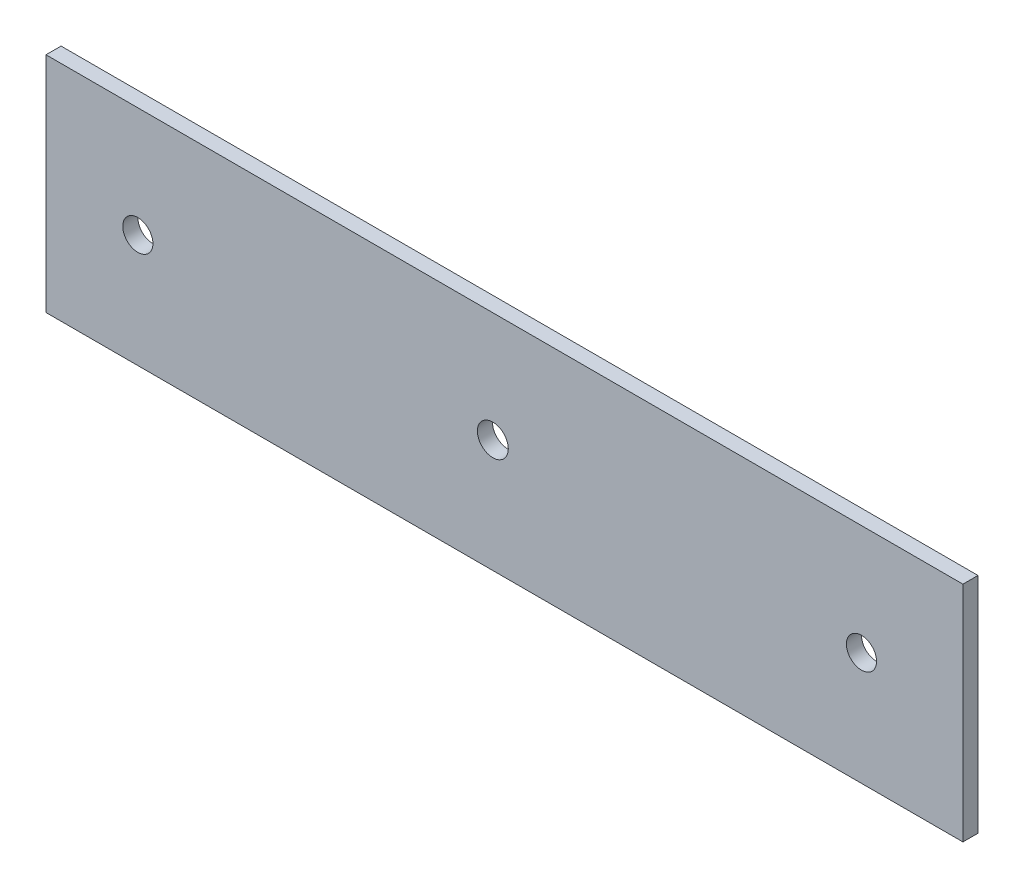
ISO-10303-21;
HEADER;
FILE_DESCRIPTION(('STEP AP214'),'2;1');
FILE_NAME('part.step','',(''),(''),'','','');
FILE_SCHEMA(('AUTOMOTIVE_DESIGN { 1 0 10303 214 1 1 1 1 }'));
ENDSEC;
DATA;
#1=APPLICATION_CONTEXT('core data for automotive mechanical design processes');
#2=APPLICATION_PROTOCOL_DEFINITION('international standard','automotive_design',2000,#1);
#3=PRODUCT_CONTEXT('',#1,'mechanical');
#4=PRODUCT('Part','Part','',(#3));
#5=PRODUCT_RELATED_PRODUCT_CATEGORY('part','',(#4));
#6=PRODUCT_DEFINITION_FORMATION('','',#4);
#7=PRODUCT_DEFINITION_CONTEXT('part definition',#1,'design');
#8=PRODUCT_DEFINITION('design','',#6,#7);
#9=PRODUCT_DEFINITION_SHAPE('','',#8);
#10=(LENGTH_UNIT() NAMED_UNIT(*) SI_UNIT(.MILLI.,.METRE.));
#11=(NAMED_UNIT(*) PLANE_ANGLE_UNIT() SI_UNIT($,.RADIAN.));
#12=(NAMED_UNIT(*) SI_UNIT($,.STERADIAN.) SOLID_ANGLE_UNIT());
#13=UNCERTAINTY_MEASURE_WITH_UNIT(LENGTH_MEASURE(1.E-05),#10,'distance_accuracy_value','');
#14=(GEOMETRIC_REPRESENTATION_CONTEXT(3) GLOBAL_UNCERTAINTY_ASSIGNED_CONTEXT((#13)) GLOBAL_UNIT_ASSIGNED_CONTEXT((#10,
#11,#12)) REPRESENTATION_CONTEXT('',''));
#15=CARTESIAN_POINT('',(0.,0.,0.));
#16=DIRECTION('',(0.,0.,1.));
#17=DIRECTION('',(1.,0.,0.));
#18=AXIS2_PLACEMENT_3D('',#15,#16,#17);
#19=CARTESIAN_POINT('',(0.,0.,3.175));
#20=DIRECTION('',(0.,0.,1.));
#21=DIRECTION('',(1.,0.,0.));
#22=AXIS2_PLACEMENT_3D('',#19,#20,#21);
#23=PLANE('',#22);
#24=CARTESIAN_POINT('',(228.6,-2.22044604925031E-13,3.175));
#25=DIRECTION('',(0.,0.,1.));
#26=DIRECTION('',(1.,0.,0.));
#27=AXIS2_PLACEMENT_3D('',#24,#25,#26);
#28=CIRCLE('',#27,3.175);
#29=CARTESIAN_POINT('',(231.775,-2.22044604925031E-13,3.175));
#30=VERTEX_POINT('',#29);
#31=EDGE_CURVE('E121',#30,#30,#28,.T.);
#32=ORIENTED_EDGE('',*,*,#31,.F.);
#33=EDGE_LOOP('',(#32));
#34=FACE_BOUND('',#33,.T.);
#35=DIRECTION('',(0.,-1.,0.));
#36=VECTOR('',#35,1.);
#37=CARTESIAN_POINT('',(56.8583118313128,23.1921422315717,3.175));
#38=LINE('',#37,#36);
#39=CARTESIAN_POINT('',(56.8583118313128,23.1921422315717,3.175));
#40=VERTEX_POINT('',#39);
#41=CARTESIAN_POINT('',(56.8583118313128,-23.8262851471424,3.175));
#42=VERTEX_POINT('',#41);
#43=EDGE_CURVE('E91',#40,#42,#38,.T.);
#44=ORIENTED_EDGE('',*,*,#43,.T.);
#45=DIRECTION('',(1.,0.,0.));
#46=VECTOR('',#45,1.);
#47=CARTESIAN_POINT('',(56.8583118313128,-23.8262851471424,3.175));
#48=LINE('',#47,#46);
#49=CARTESIAN_POINT('',(249.961982233685,-23.8262851471424,3.175));
#50=VERTEX_POINT('',#49);
#51=EDGE_CURVE('E86',#42,#50,#48,.T.);
#52=ORIENTED_EDGE('',*,*,#51,.T.);
#53=DIRECTION('',(0.,1.,0.));
#54=VECTOR('',#53,1.);
#55=CARTESIAN_POINT('',(249.961982233685,23.1921422315717,3.175));
#56=LINE('',#55,#54);
#57=CARTESIAN_POINT('',(249.961982233685,23.1921422315717,3.175));
#58=VERTEX_POINT('',#57);
#59=EDGE_CURVE('E89',#50,#58,#56,.T.);
#60=ORIENTED_EDGE('',*,*,#59,.T.);
#61=DIRECTION('',(-1.,0.,0.));
#62=VECTOR('',#61,1.);
#63=CARTESIAN_POINT('',(56.8583118313128,23.1921422315717,3.175));
#64=LINE('',#63,#62);
#65=EDGE_CURVE('E56',#58,#40,#64,.T.);
#66=ORIENTED_EDGE('',*,*,#65,.T.);
#67=EDGE_LOOP('',(#44,#52,#60,#66));
#68=FACE_BOUND('',#67,.T.);
#69=CARTESIAN_POINT('',(76.2,5.55111512312578E-13,3.175));
#70=DIRECTION('',(0.,0.,1.));
#71=DIRECTION('',(1.,0.,0.));
#72=AXIS2_PLACEMENT_3D('',#69,#70,#71);
#73=CIRCLE('',#72,3.175);
#74=CARTESIAN_POINT('',(79.375,5.55111512312578E-13,3.175));
#75=VERTEX_POINT('',#74);
#76=EDGE_CURVE('E106',#75,#75,#73,.T.);
#77=ORIENTED_EDGE('',*,*,#76,.F.);
#78=EDGE_LOOP('',(#77));
#79=FACE_BOUND('',#78,.T.);
#80=CARTESIAN_POINT('',(150.964022252178,0.,3.175));
#81=DIRECTION('',(0.,0.,1.));
#82=DIRECTION('',(1.,0.,0.));
#83=AXIS2_PLACEMENT_3D('',#80,#81,#82);
#84=CIRCLE('',#83,3.25120000000001);
#85=CARTESIAN_POINT('',(154.215222252178,0.,3.175));
#86=VERTEX_POINT('',#85);
#87=EDGE_CURVE('E127',#86,#86,#84,.T.);
#88=ORIENTED_EDGE('',*,*,#87,.F.);
#89=EDGE_LOOP('',(#88));
#90=FACE_BOUND('',#89,.T.);
#91=ADVANCED_FACE('F39',(#34,#68,#79,#90),#23,.T.);
#92=CARTESIAN_POINT('',(0.,0.,0.));
#93=DIRECTION('',(0.,0.,1.));
#94=DIRECTION('',(1.,0.,0.));
#95=AXIS2_PLACEMENT_3D('',#92,#93,#94);
#96=PLANE('',#95);
#97=DIRECTION('',(0.,-1.,0.));
#98=VECTOR('',#97,1.);
#99=CARTESIAN_POINT('',(56.8583118313128,23.1921422315717,0.));
#100=LINE('',#99,#98);
#101=CARTESIAN_POINT('',(56.8583118313128,23.1921422315717,0.));
#102=VERTEX_POINT('',#101);
#103=CARTESIAN_POINT('',(56.8583118313128,-23.8262851471424,0.));
#104=VERTEX_POINT('',#103);
#105=EDGE_CURVE('E103',#102,#104,#100,.T.);
#106=ORIENTED_EDGE('',*,*,#105,.F.);
#107=DIRECTION('',(-1.,0.,0.));
#108=VECTOR('',#107,1.);
#109=CARTESIAN_POINT('',(56.8583118313128,23.1921422315717,0.));
#110=LINE('',#109,#108);
#111=CARTESIAN_POINT('',(249.961982233685,23.1921422315717,0.));
#112=VERTEX_POINT('',#111);
#113=EDGE_CURVE('E79',#112,#102,#110,.T.);
#114=ORIENTED_EDGE('',*,*,#113,.F.);
#115=DIRECTION('',(0.,1.,0.));
#116=VECTOR('',#115,1.);
#117=CARTESIAN_POINT('',(249.961982233685,23.1921422315717,0.));
#118=LINE('',#117,#116);
#119=CARTESIAN_POINT('',(249.961982233685,-23.8262851471424,0.));
#120=VERTEX_POINT('',#119);
#121=EDGE_CURVE('E73',#120,#112,#118,.T.);
#122=ORIENTED_EDGE('',*,*,#121,.F.);
#123=DIRECTION('',(1.,0.,0.));
#124=VECTOR('',#123,1.);
#125=CARTESIAN_POINT('',(56.8583118313128,-23.8262851471424,0.));
#126=LINE('',#125,#124);
#127=EDGE_CURVE('E95',#104,#120,#126,.T.);
#128=ORIENTED_EDGE('',*,*,#127,.F.);
#129=EDGE_LOOP('',(#106,#114,#122,#128));
#130=FACE_BOUND('',#129,.T.);
#131=CARTESIAN_POINT('',(76.2,5.55111512312578E-13,0.));
#132=DIRECTION('',(0.,0.,1.));
#133=DIRECTION('',(1.,0.,0.));
#134=AXIS2_PLACEMENT_3D('',#131,#132,#133);
#135=CIRCLE('',#134,3.175);
#136=CARTESIAN_POINT('',(79.375,5.55111512312578E-13,0.));
#137=VERTEX_POINT('',#136);
#138=EDGE_CURVE('E118',#137,#137,#135,.T.);
#139=ORIENTED_EDGE('',*,*,#138,.T.);
#140=EDGE_LOOP('',(#139));
#141=FACE_BOUND('',#140,.T.);
#142=CARTESIAN_POINT('',(228.6,-2.22044604925031E-13,0.));
#143=DIRECTION('',(0.,0.,1.));
#144=DIRECTION('',(1.,0.,0.));
#145=AXIS2_PLACEMENT_3D('',#142,#143,#144);
#146=CIRCLE('',#145,3.175);
#147=CARTESIAN_POINT('',(231.775,-2.22044604925031E-13,0.));
#148=VERTEX_POINT('',#147);
#149=EDGE_CURVE('E124',#148,#148,#146,.T.);
#150=ORIENTED_EDGE('',*,*,#149,.T.);
#151=EDGE_LOOP('',(#150));
#152=FACE_BOUND('',#151,.T.);
#153=CARTESIAN_POINT('',(150.964022252178,0.,0.));
#154=DIRECTION('',(0.,0.,1.));
#155=DIRECTION('',(1.,0.,0.));
#156=AXIS2_PLACEMENT_3D('',#153,#154,#155);
#157=CIRCLE('',#156,3.25120000000001);
#158=CARTESIAN_POINT('',(154.215222252178,0.,0.));
#159=VERTEX_POINT('',#158);
#160=EDGE_CURVE('E130',#159,#159,#157,.T.);
#161=ORIENTED_EDGE('',*,*,#160,.T.);
#162=EDGE_LOOP('',(#161));
#163=FACE_BOUND('',#162,.T.);
#164=ADVANCED_FACE('F114',(#130,#141,#152,#163),#96,.F.);
#165=CARTESIAN_POINT('',(56.8583118313128,23.1921422315717,3.175));
#166=DIRECTION('',(1.,0.,0.));
#167=DIRECTION('',(0.,0.,-1.));
#168=AXIS2_PLACEMENT_3D('',#165,#166,#167);
#169=PLANE('',#168);
#170=ORIENTED_EDGE('',*,*,#105,.T.);
#171=DIRECTION('',(0.,0.,-1.));
#172=VECTOR('',#171,1.);
#173=CARTESIAN_POINT('',(56.8583118313128,-23.8262851471424,3.175));
#174=LINE('',#173,#172);
#175=EDGE_CURVE('E11',#42,#104,#174,.T.);
#176=ORIENTED_EDGE('',*,*,#175,.F.);
#177=ORIENTED_EDGE('',*,*,#43,.F.);
#178=DIRECTION('',(0.,0.,-1.));
#179=VECTOR('',#178,1.);
#180=CARTESIAN_POINT('',(56.8583118313128,23.1921422315717,3.175));
#181=LINE('',#180,#179);
#182=EDGE_CURVE('E99',#40,#102,#181,.T.);
#183=ORIENTED_EDGE('',*,*,#182,.T.);
#184=EDGE_LOOP('',(#170,#176,#177,#183));
#185=FACE_BOUND('',#184,.T.);
#186=ADVANCED_FACE('F41',(#185),#169,.F.);
#187=CARTESIAN_POINT('',(56.8583118313128,-23.8262851471424,3.175));
#188=DIRECTION('',(0.,1.,0.));
#189=DIRECTION('',(0.,0.,1.));
#190=AXIS2_PLACEMENT_3D('',#187,#188,#189);
#191=PLANE('',#190);
#192=ORIENTED_EDGE('',*,*,#127,.T.);
#193=DIRECTION('',(0.,0.,-1.));
#194=VECTOR('',#193,1.);
#195=CARTESIAN_POINT('',(249.961982233685,-23.8262851471424,3.175));
#196=LINE('',#195,#194);
#197=EDGE_CURVE('E48',#50,#120,#196,.T.);
#198=ORIENTED_EDGE('',*,*,#197,.F.);
#199=ORIENTED_EDGE('',*,*,#51,.F.);
#200=ORIENTED_EDGE('',*,*,#175,.T.);
#201=EDGE_LOOP('',(#192,#198,#199,#200));
#202=FACE_BOUND('',#201,.T.);
#203=ADVANCED_FACE('F94',(#202),#191,.F.);
#204=CARTESIAN_POINT('',(249.961982233685,23.1921422315717,3.175));
#205=DIRECTION('',(-1.,0.,0.));
#206=DIRECTION('',(0.,0.,1.));
#207=AXIS2_PLACEMENT_3D('',#204,#205,#206);
#208=PLANE('',#207);
#209=ORIENTED_EDGE('',*,*,#121,.T.);
#210=DIRECTION('',(0.,0.,-1.));
#211=VECTOR('',#210,1.);
#212=CARTESIAN_POINT('',(249.961982233685,23.1921422315717,3.175));
#213=LINE('',#212,#211);
#214=EDGE_CURVE('E96',#58,#112,#213,.T.);
#215=ORIENTED_EDGE('',*,*,#214,.F.);
#216=ORIENTED_EDGE('',*,*,#59,.F.);
#217=ORIENTED_EDGE('',*,*,#197,.T.);
#218=EDGE_LOOP('',(#209,#215,#216,#217));
#219=FACE_BOUND('',#218,.T.);
#220=ADVANCED_FACE('F97',(#219),#208,.F.);
#221=CARTESIAN_POINT('',(56.8583118313128,23.1921422315717,3.175));
#222=DIRECTION('',(0.,-1.,0.));
#223=DIRECTION('',(0.,0.,-1.));
#224=AXIS2_PLACEMENT_3D('',#221,#222,#223);
#225=PLANE('',#224);
#226=ORIENTED_EDGE('',*,*,#113,.T.);
#227=ORIENTED_EDGE('',*,*,#182,.F.);
#228=ORIENTED_EDGE('',*,*,#65,.F.);
#229=ORIENTED_EDGE('',*,*,#214,.T.);
#230=EDGE_LOOP('',(#226,#227,#228,#229));
#231=FACE_BOUND('',#230,.T.);
#232=ADVANCED_FACE('F111',(#231),#225,.F.);
#233=CARTESIAN_POINT('',(76.2,5.55111512312578E-13,3.175));
#234=DIRECTION('',(0.,0.,-1.));
#235=DIRECTION('',(-1.,0.,0.));
#236=AXIS2_PLACEMENT_3D('',#233,#234,#235);
#237=CYLINDRICAL_SURFACE('',#236,3.175);
#238=ORIENTED_EDGE('',*,*,#76,.T.);
#239=EDGE_LOOP('',(#238));
#240=FACE_BOUND('',#239,.T.);
#241=ORIENTED_EDGE('',*,*,#138,.F.);
#242=EDGE_LOOP('',(#241));
#243=FACE_BOUND('',#242,.T.);
#244=ADVANCED_FACE('F148',(#240,#243),#237,.F.);
#245=CARTESIAN_POINT('',(228.6,-2.22044604925031E-13,3.175));
#246=DIRECTION('',(0.,0.,-1.));
#247=DIRECTION('',(-1.,0.,0.));
#248=AXIS2_PLACEMENT_3D('',#245,#246,#247);
#249=CYLINDRICAL_SURFACE('',#248,3.175);
#250=ORIENTED_EDGE('',*,*,#31,.T.);
#251=EDGE_LOOP('',(#250));
#252=FACE_BOUND('',#251,.T.);
#253=ORIENTED_EDGE('',*,*,#149,.F.);
#254=EDGE_LOOP('',(#253));
#255=FACE_BOUND('',#254,.T.);
#256=ADVANCED_FACE('F193',(#252,#255),#249,.F.);
#257=CARTESIAN_POINT('',(150.964022252178,0.,3.175));
#258=DIRECTION('',(0.,0.,-1.));
#259=DIRECTION('',(-1.,0.,0.));
#260=AXIS2_PLACEMENT_3D('',#257,#258,#259);
#261=CYLINDRICAL_SURFACE('',#260,3.25120000000001);
#262=ORIENTED_EDGE('',*,*,#87,.T.);
#263=EDGE_LOOP('',(#262));
#264=FACE_BOUND('',#263,.T.);
#265=ORIENTED_EDGE('',*,*,#160,.F.);
#266=EDGE_LOOP('',(#265));
#267=FACE_BOUND('',#266,.T.);
#268=ADVANCED_FACE('F136',(#264,#267),#261,.F.);
#269=CLOSED_SHELL('',(#91,#164,#186,#203,#220,#232,#244,#256,#268));
#270=MANIFOLD_SOLID_BREP('B2',#269);
#271=ADVANCED_BREP_SHAPE_REPRESENTATION('',(#18,#270),#14);
#272=SHAPE_DEFINITION_REPRESENTATION(#9,#271);
ENDSEC;
END-ISO-10303-21;
